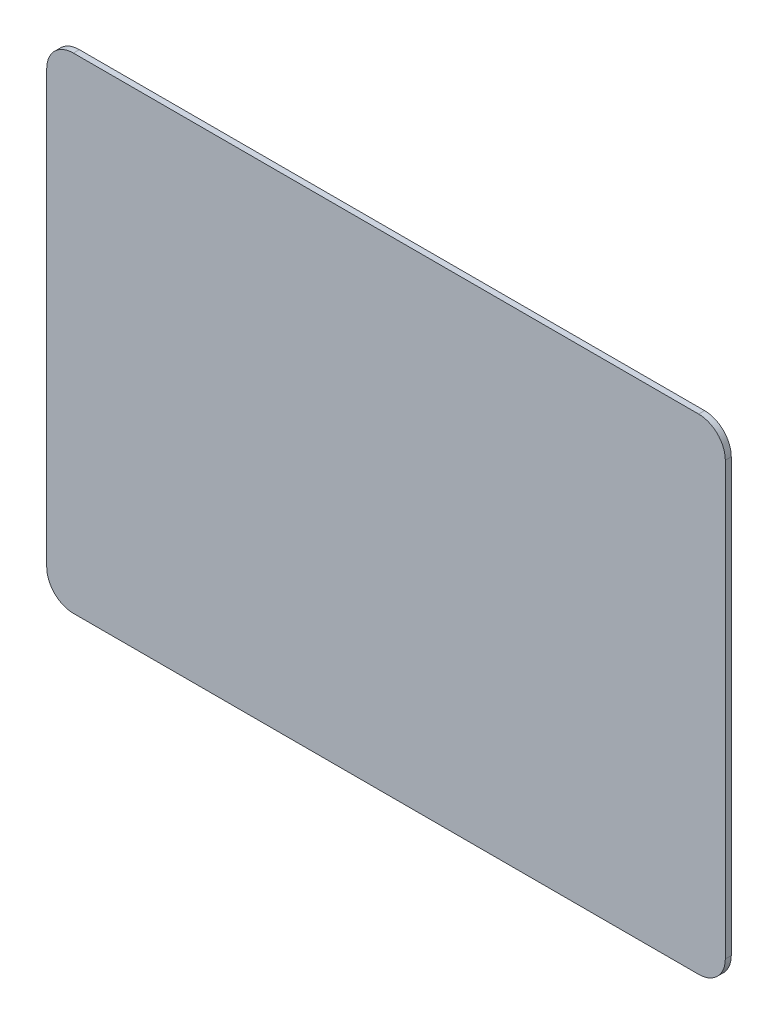
ISO-10303-21;
HEADER;
FILE_DESCRIPTION(('STEP AP214'),'2;1');
FILE_NAME('part.step','',(''),(''),'','','');
FILE_SCHEMA(('AUTOMOTIVE_DESIGN { 1 0 10303 214 1 1 1 1 }'));
ENDSEC;
DATA;
#1=APPLICATION_CONTEXT('core data for automotive mechanical design processes');
#2=APPLICATION_PROTOCOL_DEFINITION('international standard','automotive_design',2000,#1);
#3=PRODUCT_CONTEXT('',#1,'mechanical');
#4=PRODUCT('Part','Part','',(#3));
#5=PRODUCT_RELATED_PRODUCT_CATEGORY('part','',(#4));
#6=PRODUCT_DEFINITION_FORMATION('','',#4);
#7=PRODUCT_DEFINITION_CONTEXT('part definition',#1,'design');
#8=PRODUCT_DEFINITION('design','',#6,#7);
#9=PRODUCT_DEFINITION_SHAPE('','',#8);
#10=(LENGTH_UNIT() NAMED_UNIT(*) SI_UNIT(.MILLI.,.METRE.));
#11=(NAMED_UNIT(*) PLANE_ANGLE_UNIT() SI_UNIT($,.RADIAN.));
#12=(NAMED_UNIT(*) SI_UNIT($,.STERADIAN.) SOLID_ANGLE_UNIT());
#13=UNCERTAINTY_MEASURE_WITH_UNIT(LENGTH_MEASURE(1.E-05),#10,'distance_accuracy_value','');
#14=(GEOMETRIC_REPRESENTATION_CONTEXT(3) GLOBAL_UNCERTAINTY_ASSIGNED_CONTEXT((#13)) GLOBAL_UNIT_ASSIGNED_CONTEXT((#10,
#11,#12)) REPRESENTATION_CONTEXT('',''));
#15=CARTESIAN_POINT('',(0.,0.,0.));
#16=DIRECTION('',(0.,0.,1.));
#17=DIRECTION('',(1.,0.,0.));
#18=AXIS2_PLACEMENT_3D('',#15,#16,#17);
#19=CARTESIAN_POINT('',(-41.4059441680608,20.5322162383545,-3.175));
#20=DIRECTION('',(0.,0.,1.));
#21=DIRECTION('',(1.,0.,0.));
#22=AXIS2_PLACEMENT_3D('',#19,#20,#21);
#23=CYLINDRICAL_SURFACE('',#22,14.224);
#24=CARTESIAN_POINT('',(-41.4059441680608,20.5322162383545,0.));
#25=DIRECTION('',(0.,0.,1.));
#26=DIRECTION('',(1.,0.,0.));
#27=AXIS2_PLACEMENT_3D('',#24,#25,#26);
#28=CIRCLE('',#27,14.224);
#29=CARTESIAN_POINT('',(-41.4059441680608,34.7562162383545,0.));
#30=VERTEX_POINT('',#29);
#31=CARTESIAN_POINT('',(-55.6299441680608,20.5322162383545,0.));
#32=VERTEX_POINT('',#31);
#33=EDGE_CURVE('E130',#30,#32,#28,.T.);
#34=ORIENTED_EDGE('',*,*,#33,.F.);
#35=DIRECTION('',(0.,0.,1.));
#36=VECTOR('',#35,1.);
#37=CARTESIAN_POINT('',(-41.4059441680608,34.7562162383545,-3.175));
#38=LINE('',#37,#36);
#39=CARTESIAN_POINT('',(-41.4059441680608,34.7562162383545,-3.175));
#40=VERTEX_POINT('',#39);
#41=EDGE_CURVE('E11',#40,#30,#38,.T.);
#42=ORIENTED_EDGE('',*,*,#41,.F.);
#43=CARTESIAN_POINT('',(-41.4059441680608,20.5322162383545,-3.175));
#44=DIRECTION('',(0.,0.,1.));
#45=DIRECTION('',(1.,0.,0.));
#46=AXIS2_PLACEMENT_3D('',#43,#44,#45);
#47=CIRCLE('',#46,14.224);
#48=CARTESIAN_POINT('',(-55.6299441680608,20.5322162383545,-3.175));
#49=VERTEX_POINT('',#48);
#50=EDGE_CURVE('E150',#40,#49,#47,.T.);
#51=ORIENTED_EDGE('',*,*,#50,.T.);
#52=DIRECTION('',(0.,0.,1.));
#53=VECTOR('',#52,1.);
#54=CARTESIAN_POINT('',(-55.6299441680608,20.5322162383545,-3.175));
#55=LINE('',#54,#53);
#56=EDGE_CURVE('E36',#49,#32,#55,.T.);
#57=ORIENTED_EDGE('',*,*,#56,.T.);
#58=EDGE_LOOP('',(#34,#42,#51,#57));
#59=FACE_BOUND('',#58,.T.);
#60=ADVANCED_FACE('F33',(#59),#23,.T.);
#61=CARTESIAN_POINT('',(-41.4059441680608,34.7562162383545,-3.175));
#62=DIRECTION('',(0.,1.,0.));
#63=DIRECTION('',(0.,0.,1.));
#64=AXIS2_PLACEMENT_3D('',#61,#62,#63);
#65=PLANE('',#64);
#66=DIRECTION('',(-1.,0.,0.));
#67=VECTOR('',#66,1.);
#68=CARTESIAN_POINT('',(-41.4059441680608,34.7562162383545,0.));
#69=LINE('',#68,#67);
#70=CARTESIAN_POINT('',(292.096055831939,34.7562162383545,0.));
#71=VERTEX_POINT('',#70);
#72=EDGE_CURVE('E148',#71,#30,#69,.T.);
#73=ORIENTED_EDGE('',*,*,#72,.F.);
#74=DIRECTION('',(0.,0.,1.));
#75=VECTOR('',#74,1.);
#76=CARTESIAN_POINT('',(292.096055831939,34.7562162383545,-3.175));
#77=LINE('',#76,#75);
#78=CARTESIAN_POINT('',(292.096055831939,34.7562162383545,-3.175));
#79=VERTEX_POINT('',#78);
#80=EDGE_CURVE('E42',#79,#71,#77,.T.);
#81=ORIENTED_EDGE('',*,*,#80,.F.);
#82=DIRECTION('',(-1.,0.,0.));
#83=VECTOR('',#82,1.);
#84=CARTESIAN_POINT('',(-41.4059441680608,34.7562162383545,-3.175));
#85=LINE('',#84,#83);
#86=EDGE_CURVE('E120',#79,#40,#85,.T.);
#87=ORIENTED_EDGE('',*,*,#86,.T.);
#88=ORIENTED_EDGE('',*,*,#41,.T.);
#89=EDGE_LOOP('',(#73,#81,#87,#88));
#90=FACE_BOUND('',#89,.T.);
#91=ADVANCED_FACE('F162',(#90),#65,.T.);
#92=CARTESIAN_POINT('',(292.096055831939,20.5322162383545,-3.175));
#93=DIRECTION('',(0.,0.,1.));
#94=DIRECTION('',(1.,0.,0.));
#95=AXIS2_PLACEMENT_3D('',#92,#93,#94);
#96=CYLINDRICAL_SURFACE('',#95,14.224);
#97=CARTESIAN_POINT('',(292.096055831939,20.5322162383545,0.));
#98=DIRECTION('',(0.,0.,1.));
#99=DIRECTION('',(1.,0.,0.));
#100=AXIS2_PLACEMENT_3D('',#97,#98,#99);
#101=CIRCLE('',#100,14.224);
#102=CARTESIAN_POINT('',(306.320055831939,20.5322162383545,0.));
#103=VERTEX_POINT('',#102);
#104=EDGE_CURVE('E107',#103,#71,#101,.T.);
#105=ORIENTED_EDGE('',*,*,#104,.F.);
#106=DIRECTION('',(0.,0.,1.));
#107=VECTOR('',#106,1.);
#108=CARTESIAN_POINT('',(306.320055831939,20.5322162383545,-3.175));
#109=LINE('',#108,#107);
#110=CARTESIAN_POINT('',(306.320055831939,20.5322162383545,-3.175));
#111=VERTEX_POINT('',#110);
#112=EDGE_CURVE('E102',#111,#103,#109,.T.);
#113=ORIENTED_EDGE('',*,*,#112,.F.);
#114=CARTESIAN_POINT('',(292.096055831939,20.5322162383545,-3.175));
#115=DIRECTION('',(0.,0.,1.));
#116=DIRECTION('',(1.,0.,0.));
#117=AXIS2_PLACEMENT_3D('',#114,#115,#116);
#118=CIRCLE('',#117,14.224);
#119=EDGE_CURVE('E105',#111,#79,#118,.T.);
#120=ORIENTED_EDGE('',*,*,#119,.T.);
#121=ORIENTED_EDGE('',*,*,#80,.T.);
#122=EDGE_LOOP('',(#105,#113,#120,#121));
#123=FACE_BOUND('',#122,.T.);
#124=ADVANCED_FACE('F104',(#123),#96,.T.);
#125=CARTESIAN_POINT('',(306.320055831939,20.5322162383545,-3.175));
#126=DIRECTION('',(1.,0.,0.));
#127=DIRECTION('',(0.,0.,-1.));
#128=AXIS2_PLACEMENT_3D('',#125,#126,#127);
#129=PLANE('',#128);
#130=DIRECTION('',(0.,1.,0.));
#131=VECTOR('',#130,1.);
#132=CARTESIAN_POINT('',(306.320055831939,20.5322162383545,0.));
#133=LINE('',#132,#131);
#134=CARTESIAN_POINT('',(306.320055831939,-209.845783761645,0.));
#135=VERTEX_POINT('',#134);
#136=EDGE_CURVE('E145',#135,#103,#133,.T.);
#137=ORIENTED_EDGE('',*,*,#136,.F.);
#138=DIRECTION('',(0.,0.,1.));
#139=VECTOR('',#138,1.);
#140=CARTESIAN_POINT('',(306.320055831939,-209.845783761645,-3.175));
#141=LINE('',#140,#139);
#142=CARTESIAN_POINT('',(306.320055831939,-209.845783761645,-3.175));
#143=VERTEX_POINT('',#142);
#144=EDGE_CURVE('E112',#143,#135,#141,.T.);
#145=ORIENTED_EDGE('',*,*,#144,.F.);
#146=DIRECTION('',(0.,1.,0.));
#147=VECTOR('',#146,1.);
#148=CARTESIAN_POINT('',(306.320055831939,20.5322162383545,-3.175));
#149=LINE('',#148,#147);
#150=EDGE_CURVE('E118',#143,#111,#149,.T.);
#151=ORIENTED_EDGE('',*,*,#150,.T.);
#152=ORIENTED_EDGE('',*,*,#112,.T.);
#153=EDGE_LOOP('',(#137,#145,#151,#152));
#154=FACE_BOUND('',#153,.T.);
#155=ADVANCED_FACE('F122',(#154),#129,.T.);
#156=CARTESIAN_POINT('',(292.096055831939,-209.845783761645,-3.175));
#157=DIRECTION('',(0.,0.,1.));
#158=DIRECTION('',(1.,0.,0.));
#159=AXIS2_PLACEMENT_3D('',#156,#157,#158);
#160=CYLINDRICAL_SURFACE('',#159,14.224);
#161=CARTESIAN_POINT('',(292.096055831939,-209.845783761645,0.));
#162=DIRECTION('',(0.,0.,1.));
#163=DIRECTION('',(1.,0.,0.));
#164=AXIS2_PLACEMENT_3D('',#161,#162,#163);
#165=CIRCLE('',#164,14.224);
#166=CARTESIAN_POINT('',(292.096055831939,-224.069783761645,0.));
#167=VERTEX_POINT('',#166);
#168=EDGE_CURVE('E142',#167,#135,#165,.T.);
#169=ORIENTED_EDGE('',*,*,#168,.F.);
#170=DIRECTION('',(0.,0.,1.));
#171=VECTOR('',#170,1.);
#172=CARTESIAN_POINT('',(292.096055831939,-224.069783761645,-3.175));
#173=LINE('',#172,#171);
#174=CARTESIAN_POINT('',(292.096055831939,-224.069783761645,-3.175));
#175=VERTEX_POINT('',#174);
#176=EDGE_CURVE('E154',#175,#167,#173,.T.);
#177=ORIENTED_EDGE('',*,*,#176,.F.);
#178=CARTESIAN_POINT('',(292.096055831939,-209.845783761645,-3.175));
#179=DIRECTION('',(0.,0.,1.));
#180=DIRECTION('',(1.,0.,0.));
#181=AXIS2_PLACEMENT_3D('',#178,#179,#180);
#182=CIRCLE('',#181,14.224);
#183=EDGE_CURVE('E123',#175,#143,#182,.T.);
#184=ORIENTED_EDGE('',*,*,#183,.T.);
#185=ORIENTED_EDGE('',*,*,#144,.T.);
#186=EDGE_LOOP('',(#169,#177,#184,#185));
#187=FACE_BOUND('',#186,.T.);
#188=ADVANCED_FACE('F175',(#187),#160,.T.);
#189=CARTESIAN_POINT('',(-41.4059441680607,-224.069783761645,-3.175));
#190=DIRECTION('',(0.,-1.,0.));
#191=DIRECTION('',(0.,0.,-1.));
#192=AXIS2_PLACEMENT_3D('',#189,#190,#191);
#193=PLANE('',#192);
#194=DIRECTION('',(1.,0.,0.));
#195=VECTOR('',#194,1.);
#196=CARTESIAN_POINT('',(-41.4059441680607,-224.069783761645,0.));
#197=LINE('',#196,#195);
#198=CARTESIAN_POINT('',(-41.4059441680607,-224.069783761645,0.));
#199=VERTEX_POINT('',#198);
#200=EDGE_CURVE('E139',#199,#167,#197,.T.);
#201=ORIENTED_EDGE('',*,*,#200,.F.);
#202=DIRECTION('',(0.,0.,1.));
#203=VECTOR('',#202,1.);
#204=CARTESIAN_POINT('',(-41.4059441680607,-224.069783761645,-3.175));
#205=LINE('',#204,#203);
#206=CARTESIAN_POINT('',(-41.4059441680607,-224.069783761645,-3.175));
#207=VERTEX_POINT('',#206);
#208=EDGE_CURVE('E156',#207,#199,#205,.T.);
#209=ORIENTED_EDGE('',*,*,#208,.F.);
#210=DIRECTION('',(1.,0.,0.));
#211=VECTOR('',#210,1.);
#212=CARTESIAN_POINT('',(-41.4059441680607,-224.069783761645,-3.175));
#213=LINE('',#212,#211);
#214=EDGE_CURVE('E125',#207,#175,#213,.T.);
#215=ORIENTED_EDGE('',*,*,#214,.T.);
#216=ORIENTED_EDGE('',*,*,#176,.T.);
#217=EDGE_LOOP('',(#201,#209,#215,#216));
#218=FACE_BOUND('',#217,.T.);
#219=ADVANCED_FACE('F178',(#218),#193,.T.);
#220=CARTESIAN_POINT('',(-41.4059441680607,-209.845783761645,-3.175));
#221=DIRECTION('',(0.,0.,1.));
#222=DIRECTION('',(1.,0.,0.));
#223=AXIS2_PLACEMENT_3D('',#220,#221,#222);
#224=CYLINDRICAL_SURFACE('',#223,14.224);
#225=CARTESIAN_POINT('',(-41.4059441680607,-209.845783761645,0.));
#226=DIRECTION('',(0.,0.,1.));
#227=DIRECTION('',(1.,0.,0.));
#228=AXIS2_PLACEMENT_3D('',#225,#226,#227);
#229=CIRCLE('',#228,14.224);
#230=CARTESIAN_POINT('',(-55.6299441680607,-209.845783761645,0.));
#231=VERTEX_POINT('',#230);
#232=EDGE_CURVE('E136',#231,#199,#229,.T.);
#233=ORIENTED_EDGE('',*,*,#232,.F.);
#234=DIRECTION('',(0.,0.,1.));
#235=VECTOR('',#234,1.);
#236=CARTESIAN_POINT('',(-55.6299441680607,-209.845783761645,-3.175));
#237=LINE('',#236,#235);
#238=CARTESIAN_POINT('',(-55.6299441680607,-209.845783761645,-3.175));
#239=VERTEX_POINT('',#238);
#240=EDGE_CURVE('E157',#239,#231,#237,.T.);
#241=ORIENTED_EDGE('',*,*,#240,.F.);
#242=CARTESIAN_POINT('',(-41.4059441680607,-209.845783761645,-3.175));
#243=DIRECTION('',(0.,0.,1.));
#244=DIRECTION('',(1.,0.,0.));
#245=AXIS2_PLACEMENT_3D('',#242,#243,#244);
#246=CIRCLE('',#245,14.224);
#247=EDGE_CURVE('E253',#239,#207,#246,.T.);
#248=ORIENTED_EDGE('',*,*,#247,.T.);
#249=ORIENTED_EDGE('',*,*,#208,.T.);
#250=EDGE_LOOP('',(#233,#241,#248,#249));
#251=FACE_BOUND('',#250,.T.);
#252=ADVANCED_FACE('F182',(#251),#224,.T.);
#253=CARTESIAN_POINT('',(-55.6299441680608,20.5322162383545,-3.175));
#254=DIRECTION('',(-1.,0.,0.));
#255=DIRECTION('',(0.,-1.,0.));
#256=AXIS2_PLACEMENT_3D('',#253,#254,#255);
#257=PLANE('',#256);
#258=DIRECTION('',(0.,-1.,0.));
#259=VECTOR('',#258,1.);
#260=CARTESIAN_POINT('',(-55.6299441680608,20.5322162383545,0.));
#261=LINE('',#260,#259);
#262=EDGE_CURVE('E133',#32,#231,#261,.T.);
#263=ORIENTED_EDGE('',*,*,#262,.F.);
#264=ORIENTED_EDGE('',*,*,#56,.F.);
#265=DIRECTION('',(0.,-1.,0.));
#266=VECTOR('',#265,1.);
#267=CARTESIAN_POINT('',(-55.6299441680608,20.5322162383545,-3.175));
#268=LINE('',#267,#266);
#269=EDGE_CURVE('E254',#49,#239,#268,.T.);
#270=ORIENTED_EDGE('',*,*,#269,.T.);
#271=ORIENTED_EDGE('',*,*,#240,.T.);
#272=EDGE_LOOP('',(#263,#264,#270,#271));
#273=FACE_BOUND('',#272,.T.);
#274=ADVANCED_FACE('F159',(#273),#257,.T.);
#275=CARTESIAN_POINT('',(-41.4059441680608,20.5322162383545,-3.175));
#276=DIRECTION('',(0.,0.,1.));
#277=DIRECTION('',(1.,0.,0.));
#278=AXIS2_PLACEMENT_3D('',#275,#276,#277);
#279=PLANE('',#278);
#280=ORIENTED_EDGE('',*,*,#50,.F.);
#281=ORIENTED_EDGE('',*,*,#86,.F.);
#282=ORIENTED_EDGE('',*,*,#119,.F.);
#283=ORIENTED_EDGE('',*,*,#150,.F.);
#284=ORIENTED_EDGE('',*,*,#183,.F.);
#285=ORIENTED_EDGE('',*,*,#214,.F.);
#286=ORIENTED_EDGE('',*,*,#247,.F.);
#287=ORIENTED_EDGE('',*,*,#269,.F.);
#288=EDGE_LOOP('',(#280,#281,#282,#283,#284,#285,#286,#287));
#289=FACE_BOUND('',#288,.T.);
#290=ADVANCED_FACE('F116',(#289),#279,.F.);
#291=CARTESIAN_POINT('',(-41.4059441680608,20.5322162383545,0.));
#292=DIRECTION('',(0.,0.,1.));
#293=DIRECTION('',(1.,0.,0.));
#294=AXIS2_PLACEMENT_3D('',#291,#292,#293);
#295=PLANE('',#294);
#296=ORIENTED_EDGE('',*,*,#33,.T.);
#297=ORIENTED_EDGE('',*,*,#262,.T.);
#298=ORIENTED_EDGE('',*,*,#232,.T.);
#299=ORIENTED_EDGE('',*,*,#200,.T.);
#300=ORIENTED_EDGE('',*,*,#168,.T.);
#301=ORIENTED_EDGE('',*,*,#136,.T.);
#302=ORIENTED_EDGE('',*,*,#104,.T.);
#303=ORIENTED_EDGE('',*,*,#72,.T.);
#304=EDGE_LOOP('',(#296,#297,#298,#299,#300,#301,#302,#303));
#305=FACE_BOUND('',#304,.T.);
#306=ADVANCED_FACE('F161',(#305),#295,.T.);
#307=CLOSED_SHELL('',(#60,#91,#124,#155,#188,#219,#252,#274,#290,#306));
#308=MANIFOLD_SOLID_BREP('B2',#307);
#309=ADVANCED_BREP_SHAPE_REPRESENTATION('',(#18,#308),#14);
#310=SHAPE_DEFINITION_REPRESENTATION(#9,#309);
ENDSEC;
END-ISO-10303-21;
